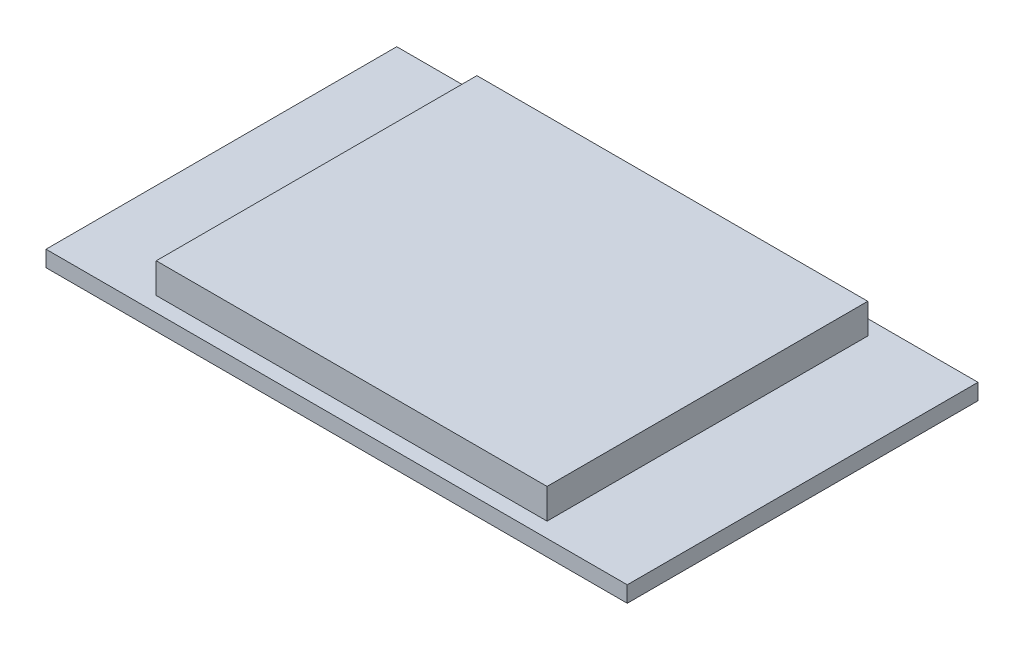
ISO-10303-21;
HEADER;
FILE_DESCRIPTION(('STEP AP214'),'2;1');
FILE_NAME('part.step','',(''),(''),'','','');
FILE_SCHEMA(('AUTOMOTIVE_DESIGN { 1 0 10303 214 1 1 1 1 }'));
ENDSEC;
DATA;
#1=APPLICATION_CONTEXT('core data for automotive mechanical design processes');
#2=APPLICATION_PROTOCOL_DEFINITION('international standard','automotive_design',2000,#1);
#3=PRODUCT_CONTEXT('',#1,'mechanical');
#4=PRODUCT('Part','Part','',(#3));
#5=PRODUCT_RELATED_PRODUCT_CATEGORY('part','',(#4));
#6=PRODUCT_DEFINITION_FORMATION('','',#4);
#7=PRODUCT_DEFINITION_CONTEXT('part definition',#1,'design');
#8=PRODUCT_DEFINITION('design','',#6,#7);
#9=PRODUCT_DEFINITION_SHAPE('','',#8);
#10=(LENGTH_UNIT() NAMED_UNIT(*) SI_UNIT(.MILLI.,.METRE.));
#11=(NAMED_UNIT(*) PLANE_ANGLE_UNIT() SI_UNIT($,.RADIAN.));
#12=(NAMED_UNIT(*) SI_UNIT($,.STERADIAN.) SOLID_ANGLE_UNIT());
#13=UNCERTAINTY_MEASURE_WITH_UNIT(LENGTH_MEASURE(1.E-05),#10,'distance_accuracy_value','');
#14=(GEOMETRIC_REPRESENTATION_CONTEXT(3) GLOBAL_UNCERTAINTY_ASSIGNED_CONTEXT((#13)) GLOBAL_UNIT_ASSIGNED_CONTEXT((#10,
#11,#12)) REPRESENTATION_CONTEXT('',''));
#15=CARTESIAN_POINT('',(0.,0.,0.));
#16=DIRECTION('',(0.,0.,1.));
#17=DIRECTION('',(1.,0.,0.));
#18=AXIS2_PLACEMENT_3D('',#15,#16,#17);
#19=CARTESIAN_POINT('',(-19.5,0.,-16.));
#20=DIRECTION('',(1.,0.,0.));
#21=DIRECTION('',(0.,0.,-1.));
#22=AXIS2_PLACEMENT_3D('',#19,#20,#21);
#23=PLANE('',#22);
#24=DIRECTION('',(0.,0.,1.));
#25=VECTOR('',#24,1.);
#26=CARTESIAN_POINT('',(-19.5,-3.,-16.));
#27=LINE('',#26,#25);
#28=CARTESIAN_POINT('',(-19.5,-3.,-16.));
#29=VERTEX_POINT('',#28);
#30=CARTESIAN_POINT('',(-19.5,-3.,16.));
#31=VERTEX_POINT('',#30);
#32=EDGE_CURVE('E134',#29,#31,#27,.T.);
#33=ORIENTED_EDGE('',*,*,#32,.T.);
#34=DIRECTION('',(0.,-1.,0.));
#35=VECTOR('',#34,1.);
#36=CARTESIAN_POINT('',(-19.5,0.,16.));
#37=LINE('',#36,#35);
#38=CARTESIAN_POINT('',(-19.5,0.,16.));
#39=VERTEX_POINT('',#38);
#40=EDGE_CURVE('E11',#39,#31,#37,.T.);
#41=ORIENTED_EDGE('',*,*,#40,.F.);
#42=DIRECTION('',(0.,0.,1.));
#43=VECTOR('',#42,1.);
#44=CARTESIAN_POINT('',(-19.5,0.,-16.));
#45=LINE('',#44,#43);
#46=CARTESIAN_POINT('',(-19.5,0.,-16.));
#47=VERTEX_POINT('',#46);
#48=EDGE_CURVE('E143',#47,#39,#45,.T.);
#49=ORIENTED_EDGE('',*,*,#48,.F.);
#50=DIRECTION('',(0.,-1.,0.));
#51=VECTOR('',#50,1.);
#52=CARTESIAN_POINT('',(-19.5,0.,-16.));
#53=LINE('',#52,#51);
#54=EDGE_CURVE('E146',#47,#29,#53,.T.);
#55=ORIENTED_EDGE('',*,*,#54,.T.);
#56=EDGE_LOOP('',(#33,#41,#49,#55));
#57=FACE_BOUND('',#56,.T.);
#58=ADVANCED_FACE('F50',(#57),#23,.F.);
#59=CARTESIAN_POINT('',(-19.5,0.,16.));
#60=DIRECTION('',(0.,0.,-1.));
#61=DIRECTION('',(-1.,0.,0.));
#62=AXIS2_PLACEMENT_3D('',#59,#60,#61);
#63=PLANE('',#62);
#64=DIRECTION('',(1.,0.,0.));
#65=VECTOR('',#64,1.);
#66=CARTESIAN_POINT('',(-19.5,-3.,16.));
#67=LINE('',#66,#65);
#68=CARTESIAN_POINT('',(19.5,-3.,16.));
#69=VERTEX_POINT('',#68);
#70=EDGE_CURVE('E131',#31,#69,#67,.T.);
#71=ORIENTED_EDGE('',*,*,#70,.T.);
#72=DIRECTION('',(0.,-1.,0.));
#73=VECTOR('',#72,1.);
#74=CARTESIAN_POINT('',(19.5,0.,16.));
#75=LINE('',#74,#73);
#76=CARTESIAN_POINT('',(19.5,0.,16.));
#77=VERTEX_POINT('',#76);
#78=EDGE_CURVE('E54',#77,#69,#75,.T.);
#79=ORIENTED_EDGE('',*,*,#78,.F.);
#80=DIRECTION('',(1.,0.,0.));
#81=VECTOR('',#80,1.);
#82=CARTESIAN_POINT('',(-19.5,0.,16.));
#83=LINE('',#82,#81);
#84=EDGE_CURVE('E141',#39,#77,#83,.T.);
#85=ORIENTED_EDGE('',*,*,#84,.F.);
#86=ORIENTED_EDGE('',*,*,#40,.T.);
#87=EDGE_LOOP('',(#71,#79,#85,#86));
#88=FACE_BOUND('',#87,.T.);
#89=ADVANCED_FACE('F166',(#88),#63,.F.);
#90=CARTESIAN_POINT('',(19.5,0.,16.));
#91=DIRECTION('',(-1.,0.,0.));
#92=DIRECTION('',(0.,0.,1.));
#93=AXIS2_PLACEMENT_3D('',#90,#91,#92);
#94=PLANE('',#93);
#95=DIRECTION('',(0.,0.,-1.));
#96=VECTOR('',#95,1.);
#97=CARTESIAN_POINT('',(19.5,-3.,16.));
#98=LINE('',#97,#96);
#99=CARTESIAN_POINT('',(19.5,-3.,-16.));
#100=VERTEX_POINT('',#99);
#101=EDGE_CURVE('E155',#69,#100,#98,.T.);
#102=ORIENTED_EDGE('',*,*,#101,.T.);
#103=DIRECTION('',(0.,-1.,0.));
#104=VECTOR('',#103,1.);
#105=CARTESIAN_POINT('',(19.5,0.,-16.));
#106=LINE('',#105,#104);
#107=CARTESIAN_POINT('',(19.5,0.,-16.));
#108=VERTEX_POINT('',#107);
#109=EDGE_CURVE('E157',#108,#100,#106,.T.);
#110=ORIENTED_EDGE('',*,*,#109,.F.);
#111=DIRECTION('',(0.,0.,-1.));
#112=VECTOR('',#111,1.);
#113=CARTESIAN_POINT('',(19.5,0.,16.));
#114=LINE('',#113,#112);
#115=EDGE_CURVE('E148',#77,#108,#114,.T.);
#116=ORIENTED_EDGE('',*,*,#115,.F.);
#117=ORIENTED_EDGE('',*,*,#78,.T.);
#118=EDGE_LOOP('',(#102,#110,#116,#117));
#119=FACE_BOUND('',#118,.T.);
#120=ADVANCED_FACE('F164',(#119),#94,.F.);
#121=CARTESIAN_POINT('',(19.5,0.,-16.));
#122=DIRECTION('',(0.,0.,1.));
#123=DIRECTION('',(1.,0.,0.));
#124=AXIS2_PLACEMENT_3D('',#121,#122,#123);
#125=PLANE('',#124);
#126=DIRECTION('',(-1.,0.,0.));
#127=VECTOR('',#126,1.);
#128=CARTESIAN_POINT('',(19.5,-3.,-16.));
#129=LINE('',#128,#127);
#130=EDGE_CURVE('E145',#100,#29,#129,.T.);
#131=ORIENTED_EDGE('',*,*,#130,.T.);
#132=ORIENTED_EDGE('',*,*,#54,.F.);
#133=DIRECTION('',(-1.,0.,0.));
#134=VECTOR('',#133,1.);
#135=CARTESIAN_POINT('',(19.5,0.,-16.));
#136=LINE('',#135,#134);
#137=EDGE_CURVE('E64',#108,#47,#136,.T.);
#138=ORIENTED_EDGE('',*,*,#137,.F.);
#139=ORIENTED_EDGE('',*,*,#109,.T.);
#140=EDGE_LOOP('',(#131,#132,#138,#139));
#141=FACE_BOUND('',#140,.T.);
#142=ADVANCED_FACE('F172',(#141),#125,.F.);
#143=CARTESIAN_POINT('',(0.,0.,0.));
#144=DIRECTION('',(0.,1.,0.));
#145=DIRECTION('',(0.,0.,1.));
#146=AXIS2_PLACEMENT_3D('',#143,#144,#145);
#147=PLANE('',#146);
#148=ORIENTED_EDGE('',*,*,#48,.T.);
#149=ORIENTED_EDGE('',*,*,#84,.T.);
#150=ORIENTED_EDGE('',*,*,#115,.T.);
#151=ORIENTED_EDGE('',*,*,#137,.T.);
#152=EDGE_LOOP('',(#148,#149,#150,#151));
#153=FACE_BOUND('',#152,.T.);
#154=ADVANCED_FACE('F177',(#153),#147,.T.);
#155=CARTESIAN_POINT('',(29.,-3.,17.5));
#156=DIRECTION('',(-1.,0.,0.));
#157=DIRECTION('',(0.,0.,1.));
#158=AXIS2_PLACEMENT_3D('',#155,#156,#157);
#159=PLANE('',#158);
#160=DIRECTION('',(0.,0.,-1.));
#161=VECTOR('',#160,1.);
#162=CARTESIAN_POINT('',(29.,-4.6,17.5));
#163=LINE('',#162,#161);
#164=CARTESIAN_POINT('',(29.,-4.6,17.5));
#165=VERTEX_POINT('',#164);
#166=CARTESIAN_POINT('',(29.,-4.6,-17.5));
#167=VERTEX_POINT('',#166);
#168=EDGE_CURVE('E133',#165,#167,#163,.T.);
#169=ORIENTED_EDGE('',*,*,#168,.T.);
#170=DIRECTION('',(0.,-1.,0.));
#171=VECTOR('',#170,1.);
#172=CARTESIAN_POINT('',(29.,-3.,-17.5));
#173=LINE('',#172,#171);
#174=CARTESIAN_POINT('',(29.,-3.,-17.5));
#175=VERTEX_POINT('',#174);
#176=EDGE_CURVE('E112',#175,#167,#173,.T.);
#177=ORIENTED_EDGE('',*,*,#176,.F.);
#178=DIRECTION('',(0.,0.,-1.));
#179=VECTOR('',#178,1.);
#180=CARTESIAN_POINT('',(29.,-3.,17.5));
#181=LINE('',#180,#179);
#182=CARTESIAN_POINT('',(29.,-3.,17.5));
#183=VERTEX_POINT('',#182);
#184=EDGE_CURVE('E117',#183,#175,#181,.T.);
#185=ORIENTED_EDGE('',*,*,#184,.F.);
#186=DIRECTION('',(0.,-1.,0.));
#187=VECTOR('',#186,1.);
#188=CARTESIAN_POINT('',(29.,-3.,17.5));
#189=LINE('',#188,#187);
#190=EDGE_CURVE('E297',#183,#165,#189,.T.);
#191=ORIENTED_EDGE('',*,*,#190,.T.);
#192=EDGE_LOOP('',(#169,#177,#185,#191));
#193=FACE_BOUND('',#192,.T.);
#194=ADVANCED_FACE('F129',(#193),#159,.F.);
#195=CARTESIAN_POINT('',(-29.,-3.,-17.5));
#196=DIRECTION('',(0.,0.,1.));
#197=DIRECTION('',(1.,0.,0.));
#198=AXIS2_PLACEMENT_3D('',#195,#196,#197);
#199=PLANE('',#198);
#200=DIRECTION('',(-1.,0.,0.));
#201=VECTOR('',#200,1.);
#202=CARTESIAN_POINT('',(-29.,-4.6,-17.5));
#203=LINE('',#202,#201);
#204=CARTESIAN_POINT('',(-29.,-4.6,-17.5));
#205=VERTEX_POINT('',#204);
#206=EDGE_CURVE('E289',#167,#205,#203,.T.);
#207=ORIENTED_EDGE('',*,*,#206,.T.);
#208=DIRECTION('',(0.,-1.,0.));
#209=VECTOR('',#208,1.);
#210=CARTESIAN_POINT('',(-29.,-3.,-17.5));
#211=LINE('',#210,#209);
#212=CARTESIAN_POINT('',(-29.,-3.,-17.5));
#213=VERTEX_POINT('',#212);
#214=EDGE_CURVE('E111',#213,#205,#211,.T.);
#215=ORIENTED_EDGE('',*,*,#214,.F.);
#216=DIRECTION('',(-1.,0.,0.));
#217=VECTOR('',#216,1.);
#218=CARTESIAN_POINT('',(-29.,-3.,-17.5));
#219=LINE('',#218,#217);
#220=EDGE_CURVE('E110',#175,#213,#219,.T.);
#221=ORIENTED_EDGE('',*,*,#220,.F.);
#222=ORIENTED_EDGE('',*,*,#176,.T.);
#223=EDGE_LOOP('',(#207,#215,#221,#222));
#224=FACE_BOUND('',#223,.T.);
#225=ADVANCED_FACE('F108',(#224),#199,.F.);
#226=CARTESIAN_POINT('',(-29.,-3.,17.5));
#227=DIRECTION('',(1.,0.,0.));
#228=DIRECTION('',(0.,0.,-1.));
#229=AXIS2_PLACEMENT_3D('',#226,#227,#228);
#230=PLANE('',#229);
#231=DIRECTION('',(0.,0.,1.));
#232=VECTOR('',#231,1.);
#233=CARTESIAN_POINT('',(-29.,-4.6,17.5));
#234=LINE('',#233,#232);
#235=CARTESIAN_POINT('',(-29.,-4.6,17.5));
#236=VERTEX_POINT('',#235);
#237=EDGE_CURVE('E292',#205,#236,#234,.T.);
#238=ORIENTED_EDGE('',*,*,#237,.T.);
#239=DIRECTION('',(0.,-1.,0.));
#240=VECTOR('',#239,1.);
#241=CARTESIAN_POINT('',(-29.,-3.,17.5));
#242=LINE('',#241,#240);
#243=CARTESIAN_POINT('',(-29.,-3.,17.5));
#244=VERTEX_POINT('',#243);
#245=EDGE_CURVE('E140',#244,#236,#242,.T.);
#246=ORIENTED_EDGE('',*,*,#245,.F.);
#247=DIRECTION('',(0.,0.,1.));
#248=VECTOR('',#247,1.);
#249=CARTESIAN_POINT('',(-29.,-3.,17.5));
#250=LINE('',#249,#248);
#251=EDGE_CURVE('E119',#213,#244,#250,.T.);
#252=ORIENTED_EDGE('',*,*,#251,.F.);
#253=ORIENTED_EDGE('',*,*,#214,.T.);
#254=EDGE_LOOP('',(#238,#246,#252,#253));
#255=FACE_BOUND('',#254,.T.);
#256=ADVANCED_FACE('F241',(#255),#230,.F.);
#257=CARTESIAN_POINT('',(-29.,-3.,17.5));
#258=DIRECTION('',(0.,0.,-1.));
#259=DIRECTION('',(-1.,0.,0.));
#260=AXIS2_PLACEMENT_3D('',#257,#258,#259);
#261=PLANE('',#260);
#262=DIRECTION('',(1.,0.,0.));
#263=VECTOR('',#262,1.);
#264=CARTESIAN_POINT('',(-29.,-4.6,17.5));
#265=LINE('',#264,#263);
#266=EDGE_CURVE('E130',#236,#165,#265,.T.);
#267=ORIENTED_EDGE('',*,*,#266,.T.);
#268=ORIENTED_EDGE('',*,*,#190,.F.);
#269=DIRECTION('',(1.,0.,0.));
#270=VECTOR('',#269,1.);
#271=CARTESIAN_POINT('',(-29.,-3.,17.5));
#272=LINE('',#271,#270);
#273=EDGE_CURVE('E123',#244,#183,#272,.T.);
#274=ORIENTED_EDGE('',*,*,#273,.F.);
#275=ORIENTED_EDGE('',*,*,#245,.T.);
#276=EDGE_LOOP('',(#267,#268,#274,#275));
#277=FACE_BOUND('',#276,.T.);
#278=ADVANCED_FACE('F251',(#277),#261,.F.);
#279=CARTESIAN_POINT('',(0.,-3.,0.));
#280=DIRECTION('',(0.,-1.,0.));
#281=DIRECTION('',(0.,0.,-1.));
#282=AXIS2_PLACEMENT_3D('',#279,#280,#281);
#283=PLANE('',#282);
#284=ORIENTED_EDGE('',*,*,#32,.F.);
#285=ORIENTED_EDGE('',*,*,#130,.F.);
#286=ORIENTED_EDGE('',*,*,#101,.F.);
#287=ORIENTED_EDGE('',*,*,#70,.F.);
#288=EDGE_LOOP('',(#284,#285,#286,#287));
#289=FACE_BOUND('',#288,.T.);
#290=ORIENTED_EDGE('',*,*,#184,.T.);
#291=ORIENTED_EDGE('',*,*,#220,.T.);
#292=ORIENTED_EDGE('',*,*,#251,.T.);
#293=ORIENTED_EDGE('',*,*,#273,.T.);
#294=EDGE_LOOP('',(#290,#291,#292,#293));
#295=FACE_BOUND('',#294,.T.);
#296=ADVANCED_FACE('F122',(#289,#295),#283,.F.);
#297=CARTESIAN_POINT('',(0.,-4.6,0.));
#298=DIRECTION('',(0.,-1.,0.));
#299=DIRECTION('',(0.,0.,-1.));
#300=AXIS2_PLACEMENT_3D('',#297,#298,#299);
#301=PLANE('',#300);
#302=ORIENTED_EDGE('',*,*,#168,.F.);
#303=ORIENTED_EDGE('',*,*,#266,.F.);
#304=ORIENTED_EDGE('',*,*,#237,.F.);
#305=ORIENTED_EDGE('',*,*,#206,.F.);
#306=EDGE_LOOP('',(#302,#303,#304,#305));
#307=FACE_BOUND('',#306,.T.);
#308=ADVANCED_FACE('F269',(#307),#301,.T.);
#309=CLOSED_SHELL('',(#58,#89,#120,#142,#154,#194,#225,#256,#278,#296,#308));
#310=MANIFOLD_SOLID_BREP('B2',#309);
#311=ADVANCED_BREP_SHAPE_REPRESENTATION('',(#18,#310),#14);
#312=SHAPE_DEFINITION_REPRESENTATION(#9,#311);
ENDSEC;
END-ISO-10303-21;
